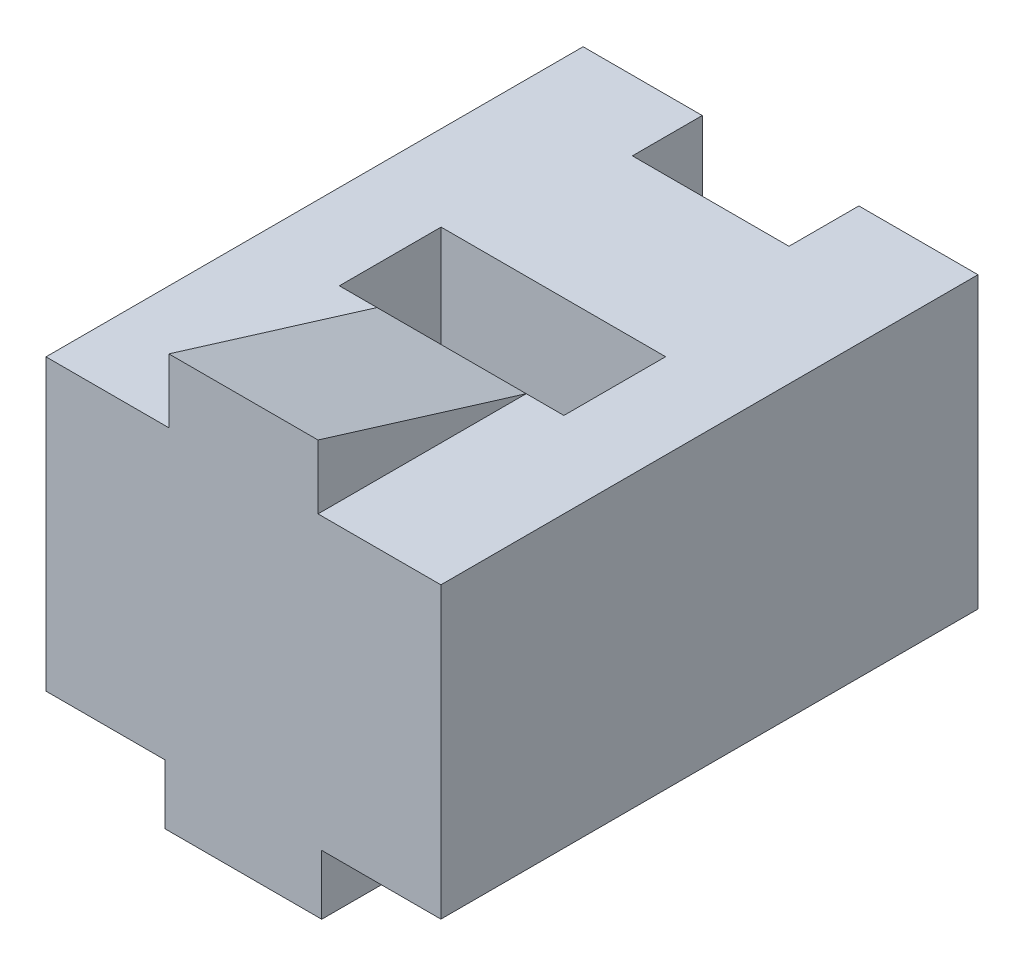
ISO-10303-21;
HEADER;
FILE_DESCRIPTION(('STEP AP214'),'2;1');
FILE_NAME('part.step','',(''),(''),'','','');
FILE_SCHEMA(('AUTOMOTIVE_DESIGN { 1 0 10303 214 1 1 1 1 }'));
ENDSEC;
DATA;
#1=APPLICATION_CONTEXT('core data for automotive mechanical design processes');
#2=APPLICATION_PROTOCOL_DEFINITION('international standard','automotive_design',2000,#1);
#3=PRODUCT_CONTEXT('',#1,'mechanical');
#4=PRODUCT('Part','Part','',(#3));
#5=PRODUCT_RELATED_PRODUCT_CATEGORY('part','',(#4));
#6=PRODUCT_DEFINITION_FORMATION('','',#4);
#7=PRODUCT_DEFINITION_CONTEXT('part definition',#1,'design');
#8=PRODUCT_DEFINITION('design','',#6,#7);
#9=PRODUCT_DEFINITION_SHAPE('','',#8);
#10=(LENGTH_UNIT() NAMED_UNIT(*) SI_UNIT(.MILLI.,.METRE.));
#11=(NAMED_UNIT(*) PLANE_ANGLE_UNIT() SI_UNIT($,.RADIAN.));
#12=(NAMED_UNIT(*) SI_UNIT($,.STERADIAN.) SOLID_ANGLE_UNIT());
#13=UNCERTAINTY_MEASURE_WITH_UNIT(LENGTH_MEASURE(1.E-05),#10,'distance_accuracy_value','');
#14=(GEOMETRIC_REPRESENTATION_CONTEXT(3) GLOBAL_UNCERTAINTY_ASSIGNED_CONTEXT((#13)) GLOBAL_UNIT_ASSIGNED_CONTEXT((#10,
#11,#12)) REPRESENTATION_CONTEXT('',''));
#15=CARTESIAN_POINT('',(0.,0.,0.));
#16=DIRECTION('',(0.,0.,1.));
#17=DIRECTION('',(1.,0.,0.));
#18=AXIS2_PLACEMENT_3D('',#15,#16,#17);
#19=CARTESIAN_POINT('',(-66.1684643345711,0.,180.));
#20=DIRECTION('',(0.,-1.,0.));
#21=DIRECTION('',(1.,0.,0.));
#22=AXIS2_PLACEMENT_3D('',#19,#20,#21);
#23=PLANE('',#22);
#24=DIRECTION('',(0.,0.,-1.));
#25=VECTOR('',#24,1.);
#26=CARTESIAN_POINT('',(25.,0.,110.232443182471));
#27=LINE('',#26,#25);
#28=CARTESIAN_POINT('',(25.,0.,180.));
#29=VERTEX_POINT('',#28);
#30=CARTESIAN_POINT('',(25.,0.,110.232443182471));
#31=VERTEX_POINT('',#30);
#32=EDGE_CURVE('E176',#29,#31,#27,.T.);
#33=ORIENTED_EDGE('',*,*,#32,.F.);
#34=DIRECTION('',(-1.,0.,0.));
#35=VECTOR('',#34,1.);
#36=CARTESIAN_POINT('',(-66.1684643345711,0.,180.));
#37=LINE('',#36,#35);
#38=CARTESIAN_POINT('',(66.1684643345711,0.,180.));
#39=VERTEX_POINT('',#38);
#40=EDGE_CURVE('E294',#39,#29,#37,.T.);
#41=ORIENTED_EDGE('',*,*,#40,.F.);
#42=DIRECTION('',(0.,0.,-1.));
#43=VECTOR('',#42,1.);
#44=CARTESIAN_POINT('',(66.1684643345711,0.,180.));
#45=LINE('',#44,#43);
#46=CARTESIAN_POINT('',(66.1684643345711,0.,0.));
#47=VERTEX_POINT('',#46);
#48=EDGE_CURVE('E310',#39,#47,#45,.T.);
#49=ORIENTED_EDGE('',*,*,#48,.T.);
#50=DIRECTION('',(-1.,0.,0.));
#51=VECTOR('',#50,1.);
#52=CARTESIAN_POINT('',(-66.1684643345711,0.,0.));
#53=LINE('',#52,#51);
#54=CARTESIAN_POINT('',(26.2408657033265,0.,0.));
#55=VERTEX_POINT('',#54);
#56=EDGE_CURVE('E287',#47,#55,#53,.T.);
#57=ORIENTED_EDGE('',*,*,#56,.T.);
#58=DIRECTION('',(0.,0.,-1.));
#59=VECTOR('',#58,1.);
#60=CARTESIAN_POINT('',(26.2408657033265,0.,0.));
#61=LINE('',#60,#59);
#62=CARTESIAN_POINT('',(26.2408657033265,0.,23.416868799503));
#63=VERTEX_POINT('',#62);
#64=EDGE_CURVE('E263',#63,#55,#61,.T.);
#65=ORIENTED_EDGE('',*,*,#64,.F.);
#66=DIRECTION('',(1.,0.,0.));
#67=VECTOR('',#66,1.);
#68=CARTESIAN_POINT('',(0.,0.,23.416868799503));
#69=LINE('',#68,#67);
#70=CARTESIAN_POINT('',(-26.2408657033265,0.,23.416868799503));
#71=VERTEX_POINT('',#70);
#72=EDGE_CURVE('E272',#71,#63,#69,.T.);
#73=ORIENTED_EDGE('',*,*,#72,.F.);
#74=DIRECTION('',(0.,0.,1.));
#75=VECTOR('',#74,1.);
#76=CARTESIAN_POINT('',(-26.2408657033265,0.,0.));
#77=LINE('',#76,#75);
#78=CARTESIAN_POINT('',(-26.2408657033265,0.,0.));
#79=VERTEX_POINT('',#78);
#80=EDGE_CURVE('E232',#79,#71,#77,.T.);
#81=ORIENTED_EDGE('',*,*,#80,.F.);
#82=CARTESIAN_POINT('',(-66.1684643345711,0.,0.));
#83=VERTEX_POINT('',#82);
#84=EDGE_CURVE('E305',#79,#83,#53,.T.);
#85=ORIENTED_EDGE('',*,*,#84,.T.);
#86=DIRECTION('',(0.,0.,-1.));
#87=VECTOR('',#86,1.);
#88=CARTESIAN_POINT('',(-66.1684643345711,0.,180.));
#89=LINE('',#88,#87);
#90=CARTESIAN_POINT('',(-66.1684643345711,0.,180.));
#91=VERTEX_POINT('',#90);
#92=EDGE_CURVE('E296',#91,#83,#89,.T.);
#93=ORIENTED_EDGE('',*,*,#92,.F.);
#94=CARTESIAN_POINT('',(-25.,0.,180.));
#95=VERTEX_POINT('',#94);
#96=EDGE_CURVE('E293',#95,#91,#37,.T.);
#97=ORIENTED_EDGE('',*,*,#96,.F.);
#98=DIRECTION('',(0.,0.,-1.));
#99=VECTOR('',#98,1.);
#100=CARTESIAN_POINT('',(-25.,0.,110.232443182471));
#101=LINE('',#100,#99);
#102=CARTESIAN_POINT('',(-25.,0.,110.232443182471));
#103=VERTEX_POINT('',#102);
#104=EDGE_CURVE('E501',#95,#103,#101,.T.);
#105=ORIENTED_EDGE('',*,*,#104,.T.);
#106=DIRECTION('',(1.,0.,0.));
#107=VECTOR('',#106,1.);
#108=CARTESIAN_POINT('',(0.,0.,110.232443182471));
#109=LINE('',#108,#107);
#110=CARTESIAN_POINT('',(-37.6250252536864,0.,110.232443182471));
#111=VERTEX_POINT('',#110);
#112=EDGE_CURVE('E193',#111,#103,#109,.T.);
#113=ORIENTED_EDGE('',*,*,#112,.F.);
#114=DIRECTION('',(0.,0.,1.));
#115=VECTOR('',#114,1.);
#116=CARTESIAN_POINT('',(-37.6250252536864,0.,0.));
#117=LINE('',#116,#115);
#118=CARTESIAN_POINT('',(-37.6250252536864,0.,76.1438419417011));
#119=VERTEX_POINT('',#118);
#120=EDGE_CURVE('E237',#119,#111,#117,.T.);
#121=ORIENTED_EDGE('',*,*,#120,.F.);
#122=DIRECTION('',(1.,0.,0.));
#123=VECTOR('',#122,1.);
#124=CARTESIAN_POINT('',(0.,0.,76.1438419417011));
#125=LINE('',#124,#123);
#126=CARTESIAN_POINT('',(37.6250252536864,0.,76.1438419417011));
#127=VERTEX_POINT('',#126);
#128=EDGE_CURVE('E247',#119,#127,#125,.T.);
#129=ORIENTED_EDGE('',*,*,#128,.T.);
#130=DIRECTION('',(0.,0.,1.));
#131=VECTOR('',#130,1.);
#132=CARTESIAN_POINT('',(37.6250252536864,0.,0.));
#133=LINE('',#132,#131);
#134=CARTESIAN_POINT('',(37.6250252536864,0.,110.232443182471));
#135=VERTEX_POINT('',#134);
#136=EDGE_CURVE('E189',#127,#135,#133,.T.);
#137=ORIENTED_EDGE('',*,*,#136,.T.);
#138=EDGE_CURVE('E186',#31,#135,#109,.T.);
#139=ORIENTED_EDGE('',*,*,#138,.F.);
#140=EDGE_LOOP('',(#33,#41,#49,#57,#65,#73,#81,#85,#93,#97,#105,#113,#121,#129,#137,#139));
#141=FACE_BOUND('',#140,.T.);
#142=ADVANCED_FACE('F35',(#141),#23,.F.);
#143=CARTESIAN_POINT('',(-66.168464334571,-97.0340558921243,180.));
#144=DIRECTION('',(0.,1.,0.));
#145=DIRECTION('',(-1.,0.,0.));
#146=AXIS2_PLACEMENT_3D('',#143,#144,#145);
#147=PLANE('',#146);
#148=DIRECTION('',(0.,0.,1.));
#149=VECTOR('',#148,1.);
#150=CARTESIAN_POINT('',(-37.6250252536864,-97.0340558921243,0.));
#151=LINE('',#150,#149);
#152=CARTESIAN_POINT('',(-37.6250252536864,-97.0340558921243,76.1438419417011));
#153=VERTEX_POINT('',#152);
#154=CARTESIAN_POINT('',(-37.6250252536864,-97.0340558921243,110.232443182471));
#155=VERTEX_POINT('',#154);
#156=EDGE_CURVE('E242',#153,#155,#151,.T.);
#157=ORIENTED_EDGE('',*,*,#156,.T.);
#158=DIRECTION('',(1.,0.,0.));
#159=VECTOR('',#158,1.);
#160=CARTESIAN_POINT('',(0.,-97.0340558921243,110.232443182471));
#161=LINE('',#160,#159);
#162=CARTESIAN_POINT('',(37.6250252536864,-97.0340558921243,110.232443182471));
#163=VERTEX_POINT('',#162);
#164=EDGE_CURVE('E233',#155,#163,#161,.T.);
#165=ORIENTED_EDGE('',*,*,#164,.T.);
#166=DIRECTION('',(0.,0.,1.));
#167=VECTOR('',#166,1.);
#168=CARTESIAN_POINT('',(37.6250252536864,-97.0340558921243,0.));
#169=LINE('',#168,#167);
#170=CARTESIAN_POINT('',(37.6250252536864,-97.0340558921242,76.1438419417011));
#171=VERTEX_POINT('',#170);
#172=EDGE_CURVE('E236',#171,#163,#169,.T.);
#173=ORIENTED_EDGE('',*,*,#172,.F.);
#174=DIRECTION('',(1.,0.,0.));
#175=VECTOR('',#174,1.);
#176=CARTESIAN_POINT('',(0.,-97.0340558921243,76.1438419417011));
#177=LINE('',#176,#175);
#178=EDGE_CURVE('E239',#153,#171,#177,.T.);
#179=ORIENTED_EDGE('',*,*,#178,.F.);
#180=EDGE_LOOP('',(#157,#165,#173,#179));
#181=FACE_BOUND('',#180,.T.);
#182=DIRECTION('',(0.,0.,-1.));
#183=VECTOR('',#182,1.);
#184=CARTESIAN_POINT('',(-26.2408657033266,-97.0340558921242,0.));
#185=LINE('',#184,#183);
#186=CARTESIAN_POINT('',(-26.2408657033265,-97.0340558921242,180.));
#187=VERTEX_POINT('',#186);
#188=CARTESIAN_POINT('',(-26.2408657033265,-97.0340558921242,157.318856407132));
#189=VERTEX_POINT('',#188);
#190=EDGE_CURVE('E209',#187,#189,#185,.T.);
#191=ORIENTED_EDGE('',*,*,#190,.F.);
#192=DIRECTION('',(1.,0.,0.));
#193=VECTOR('',#192,1.);
#194=CARTESIAN_POINT('',(-66.168464334571,-97.0340558921243,180.));
#195=LINE('',#194,#193);
#196=CARTESIAN_POINT('',(-66.168464334571,-97.0340558921243,180.));
#197=VERTEX_POINT('',#196);
#198=EDGE_CURVE('E288',#197,#187,#195,.T.);
#199=ORIENTED_EDGE('',*,*,#198,.F.);
#200=DIRECTION('',(0.,0.,-1.));
#201=VECTOR('',#200,1.);
#202=CARTESIAN_POINT('',(-66.168464334571,-97.0340558921243,180.));
#203=LINE('',#202,#201);
#204=CARTESIAN_POINT('',(-66.168464334571,-97.0340558921243,0.));
#205=VERTEX_POINT('',#204);
#206=EDGE_CURVE('E11',#197,#205,#203,.T.);
#207=ORIENTED_EDGE('',*,*,#206,.T.);
#208=DIRECTION('',(1.,0.,0.));
#209=VECTOR('',#208,1.);
#210=CARTESIAN_POINT('',(-66.168464334571,-97.0340558921243,0.));
#211=LINE('',#210,#209);
#212=CARTESIAN_POINT('',(-26.2408657033265,-97.0340558921242,0.));
#213=VERTEX_POINT('',#212);
#214=EDGE_CURVE('E300',#205,#213,#211,.T.);
#215=ORIENTED_EDGE('',*,*,#214,.T.);
#216=DIRECTION('',(0.,0.,1.));
#217=VECTOR('',#216,1.);
#218=CARTESIAN_POINT('',(-26.2408657033265,-97.0340558921243,0.));
#219=LINE('',#218,#217);
#220=CARTESIAN_POINT('',(-26.2408657033265,-97.0340558921243,23.416868799503));
#221=VERTEX_POINT('',#220);
#222=EDGE_CURVE('E259',#213,#221,#219,.T.);
#223=ORIENTED_EDGE('',*,*,#222,.T.);
#224=DIRECTION('',(1.,0.,0.));
#225=VECTOR('',#224,1.);
#226=CARTESIAN_POINT('',(0.,-97.0340558921243,23.416868799503));
#227=LINE('',#226,#225);
#228=CARTESIAN_POINT('',(26.2408657033265,-97.0340558921243,23.416868799503));
#229=VERTEX_POINT('',#228);
#230=EDGE_CURVE('E262',#221,#229,#227,.T.);
#231=ORIENTED_EDGE('',*,*,#230,.T.);
#232=DIRECTION('',(0.,0.,-1.));
#233=VECTOR('',#232,1.);
#234=CARTESIAN_POINT('',(26.2408657033265,-97.0340558921243,0.));
#235=LINE('',#234,#233);
#236=CARTESIAN_POINT('',(26.2408657033265,-97.0340558921243,0.));
#237=VERTEX_POINT('',#236);
#238=EDGE_CURVE('E266',#229,#237,#235,.T.);
#239=ORIENTED_EDGE('',*,*,#238,.T.);
#240=CARTESIAN_POINT('',(66.1684643345711,-97.0340558921242,0.));
#241=VERTEX_POINT('',#240);
#242=EDGE_CURVE('E299',#237,#241,#211,.T.);
#243=ORIENTED_EDGE('',*,*,#242,.T.);
#244=DIRECTION('',(0.,0.,-1.));
#245=VECTOR('',#244,1.);
#246=CARTESIAN_POINT('',(66.1684643345711,-97.0340558921242,180.));
#247=LINE('',#246,#245);
#248=CARTESIAN_POINT('',(66.1684643345711,-97.0340558921242,180.));
#249=VERTEX_POINT('',#248);
#250=EDGE_CURVE('E43',#249,#241,#247,.T.);
#251=ORIENTED_EDGE('',*,*,#250,.F.);
#252=CARTESIAN_POINT('',(26.2408657033265,-97.0340558921242,180.));
#253=VERTEX_POINT('',#252);
#254=EDGE_CURVE('E286',#253,#249,#195,.T.);
#255=ORIENTED_EDGE('',*,*,#254,.F.);
#256=DIRECTION('',(0.,0.,1.));
#257=VECTOR('',#256,1.);
#258=CARTESIAN_POINT('',(26.2408657033267,-97.0340558921242,0.));
#259=LINE('',#258,#257);
#260=CARTESIAN_POINT('',(26.2408657033265,-97.0340558921242,157.318856407132));
#261=VERTEX_POINT('',#260);
#262=EDGE_CURVE('E217',#261,#253,#259,.T.);
#263=ORIENTED_EDGE('',*,*,#262,.F.);
#264=DIRECTION('',(1.,0.,0.));
#265=VECTOR('',#264,1.);
#266=CARTESIAN_POINT('',(0.,-97.0340558921242,157.318856407132));
#267=LINE('',#266,#265);
#268=EDGE_CURVE('E58',#189,#261,#267,.T.);
#269=ORIENTED_EDGE('',*,*,#268,.F.);
#270=EDGE_LOOP('',(#191,#199,#207,#215,#223,#231,#239,#243,#251,#255,#263,#269));
#271=FACE_BOUND('',#270,.T.);
#272=ADVANCED_FACE('F329',(#181,#271),#147,.F.);
#273=CARTESIAN_POINT('',(0.,0.,0.));
#274=DIRECTION('',(0.,0.,1.));
#275=DIRECTION('',(1.,0.,0.));
#276=AXIS2_PLACEMENT_3D('',#273,#274,#275);
#277=PLANE('',#276);
#278=ORIENTED_EDGE('',*,*,#242,.F.);
#279=DIRECTION('',(0.,1.,0.));
#280=VECTOR('',#279,1.);
#281=CARTESIAN_POINT('',(26.2408657033265,-97.0340558921243,0.));
#282=LINE('',#281,#280);
#283=EDGE_CURVE('E194',#237,#55,#282,.T.);
#284=ORIENTED_EDGE('',*,*,#283,.T.);
#285=ORIENTED_EDGE('',*,*,#56,.F.);
#286=DIRECTION('',(0.,1.,0.));
#287=VECTOR('',#286,1.);
#288=CARTESIAN_POINT('',(66.1684643345711,0.,0.));
#289=LINE('',#288,#287);
#290=EDGE_CURVE('E303',#241,#47,#289,.T.);
#291=ORIENTED_EDGE('',*,*,#290,.F.);
#292=EDGE_LOOP('',(#278,#284,#285,#291));
#293=FACE_BOUND('',#292,.T.);
#294=ADVANCED_FACE('F322',(#293),#277,.F.);
#295=CARTESIAN_POINT('',(-66.1684643345711,0.,180.));
#296=DIRECTION('',(1.,0.,0.));
#297=DIRECTION('',(0.,1.,0.));
#298=AXIS2_PLACEMENT_3D('',#295,#296,#297);
#299=PLANE('',#298);
#300=DIRECTION('',(0.,-1.,0.));
#301=VECTOR('',#300,1.);
#302=CARTESIAN_POINT('',(-66.1684643345711,0.,0.));
#303=LINE('',#302,#301);
#304=EDGE_CURVE('E253',#83,#205,#303,.T.);
#305=ORIENTED_EDGE('',*,*,#304,.T.);
#306=ORIENTED_EDGE('',*,*,#206,.F.);
#307=DIRECTION('',(0.,-1.,0.));
#308=VECTOR('',#307,1.);
#309=CARTESIAN_POINT('',(-66.1684643345711,0.,180.));
#310=LINE('',#309,#308);
#311=EDGE_CURVE('E283',#91,#197,#310,.T.);
#312=ORIENTED_EDGE('',*,*,#311,.F.);
#313=ORIENTED_EDGE('',*,*,#92,.T.);
#314=EDGE_LOOP('',(#305,#306,#312,#313));
#315=FACE_BOUND('',#314,.T.);
#316=ADVANCED_FACE('F37',(#315),#299,.F.);
#317=CARTESIAN_POINT('',(66.1684643345711,0.,180.));
#318=DIRECTION('',(-1.,0.,0.));
#319=DIRECTION('',(0.,-1.,0.));
#320=AXIS2_PLACEMENT_3D('',#317,#318,#319);
#321=PLANE('',#320);
#322=ORIENTED_EDGE('',*,*,#290,.T.);
#323=ORIENTED_EDGE('',*,*,#48,.F.);
#324=DIRECTION('',(0.,1.,0.));
#325=VECTOR('',#324,1.);
#326=CARTESIAN_POINT('',(66.1684643345711,0.,180.));
#327=LINE('',#326,#325);
#328=EDGE_CURVE('E291',#249,#39,#327,.T.);
#329=ORIENTED_EDGE('',*,*,#328,.F.);
#330=ORIENTED_EDGE('',*,*,#250,.T.);
#331=EDGE_LOOP('',(#322,#323,#329,#330));
#332=FACE_BOUND('',#331,.T.);
#333=ADVANCED_FACE('F317',(#332),#321,.F.);
#334=CARTESIAN_POINT('',(0.,0.,180.));
#335=DIRECTION('',(0.,0.,1.));
#336=DIRECTION('',(1.,0.,0.));
#337=AXIS2_PLACEMENT_3D('',#334,#335,#336);
#338=PLANE('',#337);
#339=ORIENTED_EDGE('',*,*,#311,.T.);
#340=ORIENTED_EDGE('',*,*,#198,.T.);
#341=DIRECTION('',(0.,1.,0.));
#342=VECTOR('',#341,1.);
#343=CARTESIAN_POINT('',(-26.2408657033265,-117.034055892124,180.));
#344=LINE('',#343,#342);
#345=CARTESIAN_POINT('',(-26.2408657033265,-117.034055892124,180.));
#346=VERTEX_POINT('',#345);
#347=EDGE_CURVE('E223',#346,#187,#344,.T.);
#348=ORIENTED_EDGE('',*,*,#347,.F.);
#349=DIRECTION('',(-1.,0.,0.));
#350=VECTOR('',#349,1.);
#351=CARTESIAN_POINT('',(0.,-117.034055892124,180.));
#352=LINE('',#351,#350);
#353=CARTESIAN_POINT('',(26.2408657033265,-117.034055892124,180.));
#354=VERTEX_POINT('',#353);
#355=EDGE_CURVE('E211',#354,#346,#352,.T.);
#356=ORIENTED_EDGE('',*,*,#355,.F.);
#357=DIRECTION('',(0.,1.,0.));
#358=VECTOR('',#357,1.);
#359=CARTESIAN_POINT('',(26.2408657033265,-117.034055892124,180.));
#360=LINE('',#359,#358);
#361=EDGE_CURVE('E226',#354,#253,#360,.T.);
#362=ORIENTED_EDGE('',*,*,#361,.T.);
#363=ORIENTED_EDGE('',*,*,#254,.T.);
#364=ORIENTED_EDGE('',*,*,#328,.T.);
#365=ORIENTED_EDGE('',*,*,#40,.T.);
#366=DIRECTION('',(0.,-1.,0.));
#367=VECTOR('',#366,1.);
#368=CARTESIAN_POINT('',(25.,0.,180.));
#369=LINE('',#368,#367);
#370=CARTESIAN_POINT('',(25.,21.4428235193693,180.));
#371=VERTEX_POINT('',#370);
#372=EDGE_CURVE('E175',#371,#29,#369,.T.);
#373=ORIENTED_EDGE('',*,*,#372,.F.);
#374=DIRECTION('',(1.,0.,0.));
#375=VECTOR('',#374,1.);
#376=CARTESIAN_POINT('',(-25.,21.4428235193693,180.));
#377=LINE('',#376,#375);
#378=CARTESIAN_POINT('',(-25.,21.4428235193693,180.));
#379=VERTEX_POINT('',#378);
#380=EDGE_CURVE('E172',#379,#371,#377,.T.);
#381=ORIENTED_EDGE('',*,*,#380,.F.);
#382=DIRECTION('',(0.,-1.,0.));
#383=VECTOR('',#382,1.);
#384=CARTESIAN_POINT('',(-25.,0.,180.));
#385=LINE('',#384,#383);
#386=EDGE_CURVE('E199',#379,#95,#385,.T.);
#387=ORIENTED_EDGE('',*,*,#386,.T.);
#388=ORIENTED_EDGE('',*,*,#96,.T.);
#389=EDGE_LOOP('',(#339,#340,#348,#356,#362,#363,#364,#365,#373,#381,#387,#388));
#390=FACE_BOUND('',#389,.T.);
#391=ADVANCED_FACE('F326',(#390),#338,.T.);
#392=ORIENTED_EDGE('',*,*,#84,.F.);
#393=DIRECTION('',(0.,1.,0.));
#394=VECTOR('',#393,1.);
#395=CARTESIAN_POINT('',(-26.2408657033265,-97.0340558921243,0.));
#396=LINE('',#395,#394);
#397=EDGE_CURVE('E269',#213,#79,#396,.T.);
#398=ORIENTED_EDGE('',*,*,#397,.F.);
#399=ORIENTED_EDGE('',*,*,#214,.F.);
#400=ORIENTED_EDGE('',*,*,#304,.F.);
#401=EDGE_LOOP('',(#392,#398,#399,#400));
#402=FACE_BOUND('',#401,.T.);
#403=ADVANCED_FACE('F350',(#402),#277,.F.);
#404=CARTESIAN_POINT('',(26.2408657033265,-97.0340558921243,0.));
#405=DIRECTION('',(1.,0.,0.));
#406=DIRECTION('',(0.,1.,0.));
#407=AXIS2_PLACEMENT_3D('',#404,#405,#406);
#408=PLANE('',#407);
#409=ORIENTED_EDGE('',*,*,#64,.T.);
#410=ORIENTED_EDGE('',*,*,#283,.F.);
#411=ORIENTED_EDGE('',*,*,#238,.F.);
#412=DIRECTION('',(0.,1.,0.));
#413=VECTOR('',#412,1.);
#414=CARTESIAN_POINT('',(26.2408657033265,-97.0340558921243,23.416868799503));
#415=LINE('',#414,#413);
#416=EDGE_CURVE('E278',#229,#63,#415,.T.);
#417=ORIENTED_EDGE('',*,*,#416,.T.);
#418=EDGE_LOOP('',(#409,#410,#411,#417));
#419=FACE_BOUND('',#418,.T.);
#420=ADVANCED_FACE('F359',(#419),#408,.F.);
#421=CARTESIAN_POINT('',(0.,-97.0340558921243,23.416868799503));
#422=DIRECTION('',(0.,0.,1.));
#423=DIRECTION('',(1.,0.,0.));
#424=AXIS2_PLACEMENT_3D('',#421,#422,#423);
#425=PLANE('',#424);
#426=ORIENTED_EDGE('',*,*,#72,.T.);
#427=ORIENTED_EDGE('',*,*,#416,.F.);
#428=ORIENTED_EDGE('',*,*,#230,.F.);
#429=DIRECTION('',(0.,1.,0.));
#430=VECTOR('',#429,1.);
#431=CARTESIAN_POINT('',(-26.2408657033265,-97.0340558921243,23.416868799503));
#432=LINE('',#431,#430);
#433=EDGE_CURVE('E280',#221,#71,#432,.T.);
#434=ORIENTED_EDGE('',*,*,#433,.T.);
#435=EDGE_LOOP('',(#426,#427,#428,#434));
#436=FACE_BOUND('',#435,.T.);
#437=ADVANCED_FACE('F355',(#436),#425,.F.);
#438=CARTESIAN_POINT('',(-26.2408657033265,-97.0340558921243,0.));
#439=DIRECTION('',(-1.,0.,0.));
#440=DIRECTION('',(0.,-1.,0.));
#441=AXIS2_PLACEMENT_3D('',#438,#439,#440);
#442=PLANE('',#441);
#443=ORIENTED_EDGE('',*,*,#80,.T.);
#444=ORIENTED_EDGE('',*,*,#433,.F.);
#445=ORIENTED_EDGE('',*,*,#222,.F.);
#446=ORIENTED_EDGE('',*,*,#397,.T.);
#447=EDGE_LOOP('',(#443,#444,#445,#446));
#448=FACE_BOUND('',#447,.T.);
#449=ADVANCED_FACE('F353',(#448),#442,.F.);
#450=CARTESIAN_POINT('',(0.,-97.0340558921243,110.232443182471));
#451=DIRECTION('',(0.,0.,1.));
#452=DIRECTION('',(1.,0.,0.));
#453=AXIS2_PLACEMENT_3D('',#450,#451,#452);
#454=PLANE('',#453);
#455=ORIENTED_EDGE('',*,*,#112,.T.);
#456=DIRECTION('',(1.,0.,0.));
#457=VECTOR('',#456,1.);
#458=CARTESIAN_POINT('',(-25.,0.,110.232443182471));
#459=LINE('',#458,#457);
#460=EDGE_CURVE('E170',#103,#31,#459,.T.);
#461=ORIENTED_EDGE('',*,*,#460,.T.);
#462=ORIENTED_EDGE('',*,*,#138,.T.);
#463=DIRECTION('',(0.,1.,0.));
#464=VECTOR('',#463,1.);
#465=CARTESIAN_POINT('',(37.6250252536864,-97.0340558921243,110.232443182471));
#466=LINE('',#465,#464);
#467=EDGE_CURVE('E244',#163,#135,#466,.T.);
#468=ORIENTED_EDGE('',*,*,#467,.F.);
#469=ORIENTED_EDGE('',*,*,#164,.F.);
#470=DIRECTION('',(0.,1.,0.));
#471=VECTOR('',#470,1.);
#472=CARTESIAN_POINT('',(-37.6250252536864,-97.0340558921243,110.232443182471));
#473=LINE('',#472,#471);
#474=EDGE_CURVE('E251',#155,#111,#473,.T.);
#475=ORIENTED_EDGE('',*,*,#474,.T.);
#476=EDGE_LOOP('',(#455,#461,#462,#468,#469,#475));
#477=FACE_BOUND('',#476,.T.);
#478=ADVANCED_FACE('F197',(#477),#454,.F.);
#479=CARTESIAN_POINT('',(-37.6250252536864,-97.0340558921243,0.));
#480=DIRECTION('',(-1.,0.,0.));
#481=DIRECTION('',(0.,-1.,0.));
#482=AXIS2_PLACEMENT_3D('',#479,#480,#481);
#483=PLANE('',#482);
#484=ORIENTED_EDGE('',*,*,#120,.T.);
#485=ORIENTED_EDGE('',*,*,#474,.F.);
#486=ORIENTED_EDGE('',*,*,#156,.F.);
#487=DIRECTION('',(0.,1.,0.));
#488=VECTOR('',#487,1.);
#489=CARTESIAN_POINT('',(-37.6250252536864,-97.0340558921243,76.1438419417011));
#490=LINE('',#489,#488);
#491=EDGE_CURVE('E254',#153,#119,#490,.T.);
#492=ORIENTED_EDGE('',*,*,#491,.T.);
#493=EDGE_LOOP('',(#484,#485,#486,#492));
#494=FACE_BOUND('',#493,.T.);
#495=ADVANCED_FACE('F456',(#494),#483,.F.);
#496=CARTESIAN_POINT('',(0.,-97.0340558921243,76.1438419417011));
#497=DIRECTION('',(0.,0.,1.));
#498=DIRECTION('',(1.,0.,0.));
#499=AXIS2_PLACEMENT_3D('',#496,#497,#498);
#500=PLANE('',#499);
#501=ORIENTED_EDGE('',*,*,#128,.F.);
#502=ORIENTED_EDGE('',*,*,#491,.F.);
#503=ORIENTED_EDGE('',*,*,#178,.T.);
#504=DIRECTION('',(0.,1.,0.));
#505=VECTOR('',#504,1.);
#506=CARTESIAN_POINT('',(37.6250252536864,-97.0340558921243,76.1438419417011));
#507=LINE('',#506,#505);
#508=EDGE_CURVE('E256',#171,#127,#507,.T.);
#509=ORIENTED_EDGE('',*,*,#508,.T.);
#510=EDGE_LOOP('',(#501,#502,#503,#509));
#511=FACE_BOUND('',#510,.T.);
#512=ADVANCED_FACE('F488',(#511),#500,.T.);
#513=CARTESIAN_POINT('',(37.6250252536864,-97.0340558921243,0.));
#514=DIRECTION('',(-1.,0.,0.));
#515=DIRECTION('',(0.,-1.,0.));
#516=AXIS2_PLACEMENT_3D('',#513,#514,#515);
#517=PLANE('',#516);
#518=ORIENTED_EDGE('',*,*,#136,.F.);
#519=ORIENTED_EDGE('',*,*,#508,.F.);
#520=ORIENTED_EDGE('',*,*,#172,.T.);
#521=ORIENTED_EDGE('',*,*,#467,.T.);
#522=EDGE_LOOP('',(#518,#519,#520,#521));
#523=FACE_BOUND('',#522,.T.);
#524=ADVANCED_FACE('F400',(#523),#517,.T.);
#525=CARTESIAN_POINT('',(0.,-117.034055892124,157.318856407132));
#526=DIRECTION('',(0.,0.,1.));
#527=DIRECTION('',(1.,0.,0.));
#528=AXIS2_PLACEMENT_3D('',#525,#526,#527);
#529=PLANE('',#528);
#530=ORIENTED_EDGE('',*,*,#268,.T.);
#531=DIRECTION('',(0.,1.,0.));
#532=VECTOR('',#531,1.);
#533=CARTESIAN_POINT('',(26.2408657033265,-117.034055892124,157.318856407132));
#534=LINE('',#533,#532);
#535=CARTESIAN_POINT('',(26.2408657033265,-117.034055892124,157.318856407132));
#536=VERTEX_POINT('',#535);
#537=EDGE_CURVE('E229',#536,#261,#534,.T.);
#538=ORIENTED_EDGE('',*,*,#537,.F.);
#539=DIRECTION('',(1.,0.,0.));
#540=VECTOR('',#539,1.);
#541=CARTESIAN_POINT('',(0.,-117.034055892124,157.318856407132));
#542=LINE('',#541,#540);
#543=CARTESIAN_POINT('',(-26.2408657033265,-117.034055892124,157.318856407132));
#544=VERTEX_POINT('',#543);
#545=EDGE_CURVE('E205',#544,#536,#542,.T.);
#546=ORIENTED_EDGE('',*,*,#545,.F.);
#547=DIRECTION('',(0.,1.,0.));
#548=VECTOR('',#547,1.);
#549=CARTESIAN_POINT('',(-26.2408657033265,-117.034055892124,157.318856407132));
#550=LINE('',#549,#548);
#551=EDGE_CURVE('E215',#544,#189,#550,.T.);
#552=ORIENTED_EDGE('',*,*,#551,.T.);
#553=EDGE_LOOP('',(#530,#538,#546,#552));
#554=FACE_BOUND('',#553,.T.);
#555=ADVANCED_FACE('F335',(#554),#529,.F.);
#556=CARTESIAN_POINT('',(26.2408657033267,-117.034055892124,0.));
#557=DIRECTION('',(-1.,0.,0.));
#558=DIRECTION('',(0.,0.,1.));
#559=AXIS2_PLACEMENT_3D('',#556,#557,#558);
#560=PLANE('',#559);
#561=ORIENTED_EDGE('',*,*,#262,.T.);
#562=ORIENTED_EDGE('',*,*,#361,.F.);
#563=DIRECTION('',(0.,0.,1.));
#564=VECTOR('',#563,1.);
#565=CARTESIAN_POINT('',(26.2408657033267,-117.034055892124,0.));
#566=LINE('',#565,#564);
#567=EDGE_CURVE('E208',#536,#354,#566,.T.);
#568=ORIENTED_EDGE('',*,*,#567,.F.);
#569=ORIENTED_EDGE('',*,*,#537,.T.);
#570=EDGE_LOOP('',(#561,#562,#568,#569));
#571=FACE_BOUND('',#570,.T.);
#572=ADVANCED_FACE('F331',(#571),#560,.F.);
#573=CARTESIAN_POINT('',(-26.2408657033266,-117.034055892124,0.));
#574=DIRECTION('',(1.,0.,0.));
#575=DIRECTION('',(0.,0.,-1.));
#576=AXIS2_PLACEMENT_3D('',#573,#574,#575);
#577=PLANE('',#576);
#578=ORIENTED_EDGE('',*,*,#190,.T.);
#579=ORIENTED_EDGE('',*,*,#551,.F.);
#580=DIRECTION('',(0.,0.,-1.));
#581=VECTOR('',#580,1.);
#582=CARTESIAN_POINT('',(-26.2408657033266,-117.034055892124,0.));
#583=LINE('',#582,#581);
#584=EDGE_CURVE('E213',#346,#544,#583,.T.);
#585=ORIENTED_EDGE('',*,*,#584,.F.);
#586=ORIENTED_EDGE('',*,*,#347,.T.);
#587=EDGE_LOOP('',(#578,#579,#585,#586));
#588=FACE_BOUND('',#587,.T.);
#589=ADVANCED_FACE('F339',(#588),#577,.F.);
#590=CARTESIAN_POINT('',(0.,-117.034055892124,0.));
#591=DIRECTION('',(0.,-1.,0.));
#592=DIRECTION('',(1.,0.,0.));
#593=AXIS2_PLACEMENT_3D('',#590,#591,#592);
#594=PLANE('',#593);
#595=ORIENTED_EDGE('',*,*,#545,.T.);
#596=ORIENTED_EDGE('',*,*,#567,.T.);
#597=ORIENTED_EDGE('',*,*,#355,.T.);
#598=ORIENTED_EDGE('',*,*,#584,.T.);
#599=EDGE_LOOP('',(#595,#596,#597,#598));
#600=FACE_BOUND('',#599,.T.);
#601=ADVANCED_FACE('F425',(#600),#594,.T.);
#602=CARTESIAN_POINT('',(-25.,21.4428235193693,180.));
#603=DIRECTION('',(0.,0.95587183668775,-0.293783988377834));
#604=DIRECTION('',(0.,0.293783988377834,0.95587183668775));
#605=AXIS2_PLACEMENT_3D('',#602,#603,#604);
#606=PLANE('',#605);
#607=ORIENTED_EDGE('',*,*,#380,.T.);
#608=DIRECTION('',(0.,0.293783988377834,0.95587183668775));
#609=VECTOR('',#608,1.);
#610=CARTESIAN_POINT('',(25.,21.4428235193693,180.));
#611=LINE('',#610,#609);
#612=EDGE_CURVE('E166',#31,#371,#611,.T.);
#613=ORIENTED_EDGE('',*,*,#612,.F.);
#614=ORIENTED_EDGE('',*,*,#460,.F.);
#615=DIRECTION('',(0.,0.293783988377834,0.95587183668775));
#616=VECTOR('',#615,1.);
#617=CARTESIAN_POINT('',(-25.,21.4428235193693,180.));
#618=LINE('',#617,#616);
#619=EDGE_CURVE('E50',#103,#379,#618,.T.);
#620=ORIENTED_EDGE('',*,*,#619,.T.);
#621=EDGE_LOOP('',(#607,#613,#614,#620));
#622=FACE_BOUND('',#621,.T.);
#623=ADVANCED_FACE('F168',(#622),#606,.T.);
#624=CARTESIAN_POINT('',(-25.,0.,0.));
#625=DIRECTION('',(-1.,0.,0.));
#626=DIRECTION('',(0.,0.,1.));
#627=AXIS2_PLACEMENT_3D('',#624,#625,#626);
#628=PLANE('',#627);
#629=ORIENTED_EDGE('',*,*,#104,.F.);
#630=ORIENTED_EDGE('',*,*,#386,.F.);
#631=ORIENTED_EDGE('',*,*,#619,.F.);
#632=EDGE_LOOP('',(#629,#630,#631));
#633=FACE_BOUND('',#632,.T.);
#634=ADVANCED_FACE('F466',(#633),#628,.T.);
#635=CARTESIAN_POINT('',(25.,0.,0.));
#636=DIRECTION('',(-1.,0.,0.));
#637=DIRECTION('',(0.,0.,1.));
#638=AXIS2_PLACEMENT_3D('',#635,#636,#637);
#639=PLANE('',#638);
#640=ORIENTED_EDGE('',*,*,#32,.T.);
#641=ORIENTED_EDGE('',*,*,#612,.T.);
#642=ORIENTED_EDGE('',*,*,#372,.T.);
#643=EDGE_LOOP('',(#640,#641,#642));
#644=FACE_BOUND('',#643,.T.);
#645=ADVANCED_FACE('F180',(#644),#639,.F.);
#646=CLOSED_SHELL('',(#142,#272,#294,#316,#333,#391,#403,#420,#437,#449,#478,#495,#512,#524,
#555,#572,#589,#601,#623,#634,#645));
#647=MANIFOLD_SOLID_BREP('B2',#646);
#648=ADVANCED_BREP_SHAPE_REPRESENTATION('',(#18,#647),#14);
#649=SHAPE_DEFINITION_REPRESENTATION(#9,#648);
ENDSEC;
END-ISO-10303-21;
